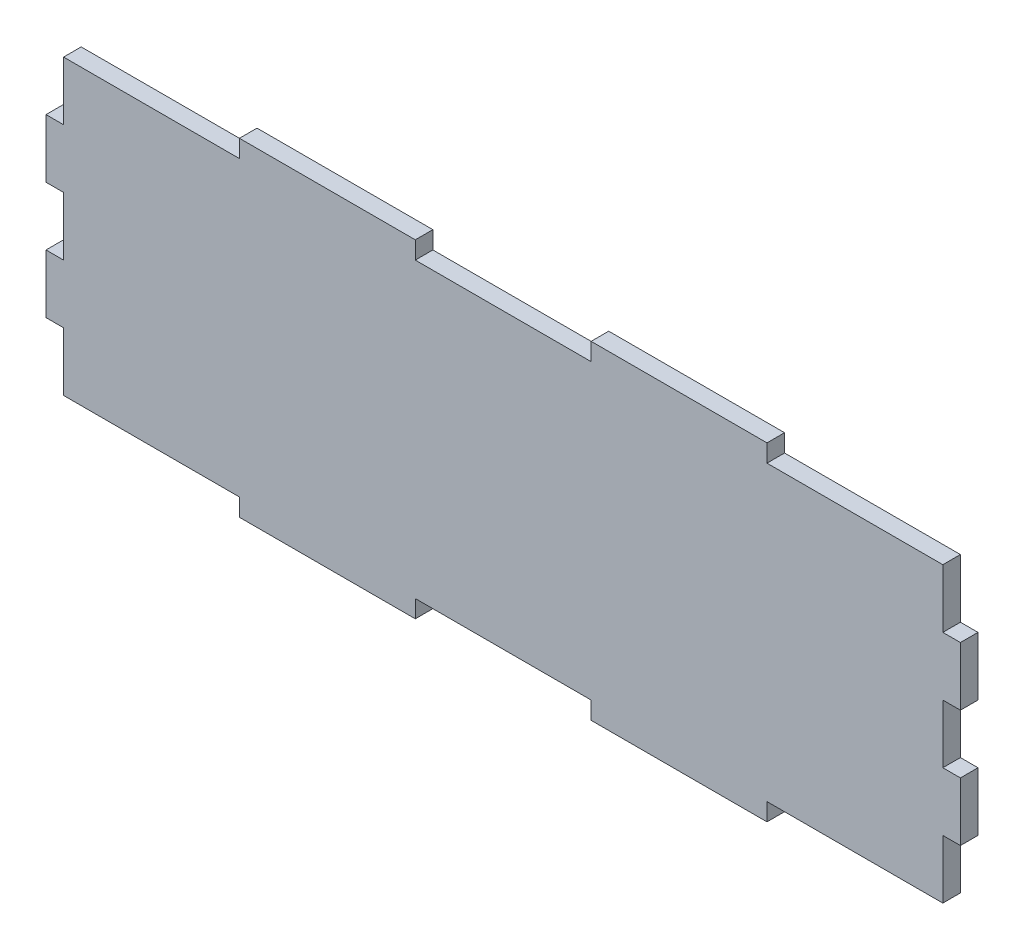
ISO-10303-21;
HEADER;
FILE_DESCRIPTION(('STEP AP214'),'2;1');
FILE_NAME('part.step','',(''),(''),'','','');
FILE_SCHEMA(('AUTOMOTIVE_DESIGN { 1 0 10303 214 1 1 1 1 }'));
ENDSEC;
DATA;
#1=APPLICATION_CONTEXT('core data for automotive mechanical design processes');
#2=APPLICATION_PROTOCOL_DEFINITION('international standard','automotive_design',2000,#1);
#3=PRODUCT_CONTEXT('',#1,'mechanical');
#4=PRODUCT('Part','Part','',(#3));
#5=PRODUCT_RELATED_PRODUCT_CATEGORY('part','',(#4));
#6=PRODUCT_DEFINITION_FORMATION('','',#4);
#7=PRODUCT_DEFINITION_CONTEXT('part definition',#1,'design');
#8=PRODUCT_DEFINITION('design','',#6,#7);
#9=PRODUCT_DEFINITION_SHAPE('','',#8);
#10=(LENGTH_UNIT() NAMED_UNIT(*) SI_UNIT(.MILLI.,.METRE.));
#11=(NAMED_UNIT(*) PLANE_ANGLE_UNIT() SI_UNIT($,.RADIAN.));
#12=(NAMED_UNIT(*) SI_UNIT($,.STERADIAN.) SOLID_ANGLE_UNIT());
#13=UNCERTAINTY_MEASURE_WITH_UNIT(LENGTH_MEASURE(1.E-05),#10,'distance_accuracy_value','');
#14=(GEOMETRIC_REPRESENTATION_CONTEXT(3) GLOBAL_UNCERTAINTY_ASSIGNED_CONTEXT((#13)) GLOBAL_UNIT_ASSIGNED_CONTEXT((#10,
#11,#12)) REPRESENTATION_CONTEXT('',''));
#15=CARTESIAN_POINT('',(0.,0.,0.));
#16=DIRECTION('',(0.,0.,1.));
#17=DIRECTION('',(1.,0.,0.));
#18=AXIS2_PLACEMENT_3D('',#15,#16,#17);
#19=CARTESIAN_POINT('',(0.,-23.,3.));
#20=DIRECTION('',(-1.,0.,0.));
#21=DIRECTION('',(0.,-1.,0.));
#22=AXIS2_PLACEMENT_3D('',#19,#20,#21);
#23=PLANE('',#22);
#24=DIRECTION('',(0.,1.,0.));
#25=VECTOR('',#24,1.);
#26=CARTESIAN_POINT('',(0.,-23.,0.));
#27=LINE('',#26,#25);
#28=CARTESIAN_POINT('',(0.,-23.,0.));
#29=VERTEX_POINT('',#28);
#30=CARTESIAN_POINT('',(0.,-20.,0.));
#31=VERTEX_POINT('',#30);
#32=EDGE_CURVE('E302',#29,#31,#27,.T.);
#33=ORIENTED_EDGE('',*,*,#32,.T.);
#34=DIRECTION('',(0.,0.,-1.));
#35=VECTOR('',#34,1.);
#36=CARTESIAN_POINT('',(0.,-20.,3.));
#37=LINE('',#36,#35);
#38=CARTESIAN_POINT('',(0.,-20.,3.));
#39=VERTEX_POINT('',#38);
#40=EDGE_CURVE('E11',#39,#31,#37,.T.);
#41=ORIENTED_EDGE('',*,*,#40,.F.);
#42=DIRECTION('',(0.,1.,0.));
#43=VECTOR('',#42,1.);
#44=CARTESIAN_POINT('',(0.,-23.,3.));
#45=LINE('',#44,#43);
#46=CARTESIAN_POINT('',(0.,-23.,3.));
#47=VERTEX_POINT('',#46);
#48=EDGE_CURVE('E372',#47,#39,#45,.T.);
#49=ORIENTED_EDGE('',*,*,#48,.F.);
#50=DIRECTION('',(0.,0.,-1.));
#51=VECTOR('',#50,1.);
#52=CARTESIAN_POINT('',(0.,-23.,3.));
#53=LINE('',#52,#51);
#54=EDGE_CURVE('E298',#47,#29,#53,.T.);
#55=ORIENTED_EDGE('',*,*,#54,.T.);
#56=EDGE_LOOP('',(#33,#41,#49,#55));
#57=FACE_BOUND('',#56,.T.);
#58=ADVANCED_FACE('F38',(#57),#23,.F.);
#59=CARTESIAN_POINT('',(0.,-20.,3.));
#60=DIRECTION('',(0.,1.,0.));
#61=DIRECTION('',(0.,0.,1.));
#62=AXIS2_PLACEMENT_3D('',#59,#60,#61);
#63=PLANE('',#62);
#64=DIRECTION('',(1.,0.,0.));
#65=VECTOR('',#64,1.);
#66=CARTESIAN_POINT('',(0.,-20.,0.));
#67=LINE('',#66,#65);
#68=CARTESIAN_POINT('',(30.,-20.,0.));
#69=VERTEX_POINT('',#68);
#70=EDGE_CURVE('E305',#31,#69,#67,.T.);
#71=ORIENTED_EDGE('',*,*,#70,.T.);
#72=DIRECTION('',(0.,0.,-1.));
#73=VECTOR('',#72,1.);
#74=CARTESIAN_POINT('',(30.,-20.,3.));
#75=LINE('',#74,#73);
#76=CARTESIAN_POINT('',(30.,-20.,3.));
#77=VERTEX_POINT('',#76);
#78=EDGE_CURVE('E46',#77,#69,#75,.T.);
#79=ORIENTED_EDGE('',*,*,#78,.F.);
#80=DIRECTION('',(1.,0.,0.));
#81=VECTOR('',#80,1.);
#82=CARTESIAN_POINT('',(0.,-20.,3.));
#83=LINE('',#82,#81);
#84=EDGE_CURVE('E181',#39,#77,#83,.T.);
#85=ORIENTED_EDGE('',*,*,#84,.F.);
#86=ORIENTED_EDGE('',*,*,#40,.T.);
#87=EDGE_LOOP('',(#71,#79,#85,#86));
#88=FACE_BOUND('',#87,.T.);
#89=ADVANCED_FACE('F570',(#88),#63,.F.);
#90=CARTESIAN_POINT('',(30.,-20.,3.));
#91=DIRECTION('',(-1.,0.,0.));
#92=DIRECTION('',(0.,0.,1.));
#93=AXIS2_PLACEMENT_3D('',#90,#91,#92);
#94=PLANE('',#93);
#95=DIRECTION('',(0.,1.,0.));
#96=VECTOR('',#95,1.);
#97=CARTESIAN_POINT('',(30.,-20.,0.));
#98=LINE('',#97,#96);
#99=CARTESIAN_POINT('',(30.,-10.,0.));
#100=VERTEX_POINT('',#99);
#101=EDGE_CURVE('E307',#69,#100,#98,.T.);
#102=ORIENTED_EDGE('',*,*,#101,.T.);
#103=DIRECTION('',(0.,0.,-1.));
#104=VECTOR('',#103,1.);
#105=CARTESIAN_POINT('',(30.,-10.,3.));
#106=LINE('',#105,#104);
#107=CARTESIAN_POINT('',(30.,-10.,3.));
#108=VERTEX_POINT('',#107);
#109=EDGE_CURVE('E463',#108,#100,#106,.T.);
#110=ORIENTED_EDGE('',*,*,#109,.F.);
#111=DIRECTION('',(0.,1.,0.));
#112=VECTOR('',#111,1.);
#113=CARTESIAN_POINT('',(30.,-20.,3.));
#114=LINE('',#113,#112);
#115=EDGE_CURVE('E471',#77,#108,#114,.T.);
#116=ORIENTED_EDGE('',*,*,#115,.F.);
#117=ORIENTED_EDGE('',*,*,#78,.T.);
#118=EDGE_LOOP('',(#102,#110,#116,#117));
#119=FACE_BOUND('',#118,.T.);
#120=ADVANCED_FACE('F469',(#119),#94,.F.);
#121=CARTESIAN_POINT('',(30.,-10.,3.));
#122=DIRECTION('',(0.,1.,0.));
#123=DIRECTION('',(-1.,0.,0.));
#124=AXIS2_PLACEMENT_3D('',#121,#122,#123);
#125=PLANE('',#124);
#126=DIRECTION('',(1.,0.,0.));
#127=VECTOR('',#126,1.);
#128=CARTESIAN_POINT('',(30.,-10.,0.));
#129=LINE('',#128,#127);
#130=CARTESIAN_POINT('',(33.,-10.,0.));
#131=VERTEX_POINT('',#130);
#132=EDGE_CURVE('E309',#100,#131,#129,.T.);
#133=ORIENTED_EDGE('',*,*,#132,.T.);
#134=DIRECTION('',(0.,0.,-1.));
#135=VECTOR('',#134,1.);
#136=CARTESIAN_POINT('',(33.,-10.,3.));
#137=LINE('',#136,#135);
#138=CARTESIAN_POINT('',(33.,-10.,3.));
#139=VERTEX_POINT('',#138);
#140=EDGE_CURVE('E460',#139,#131,#137,.T.);
#141=ORIENTED_EDGE('',*,*,#140,.F.);
#142=DIRECTION('',(1.,0.,0.));
#143=VECTOR('',#142,1.);
#144=CARTESIAN_POINT('',(30.,-10.,3.));
#145=LINE('',#144,#143);
#146=EDGE_CURVE('E489',#108,#139,#145,.T.);
#147=ORIENTED_EDGE('',*,*,#146,.F.);
#148=ORIENTED_EDGE('',*,*,#109,.T.);
#149=EDGE_LOOP('',(#133,#141,#147,#148));
#150=FACE_BOUND('',#149,.T.);
#151=ADVANCED_FACE('F480',(#150),#125,.F.);
#152=CARTESIAN_POINT('',(33.,-10.,3.));
#153=DIRECTION('',(-1.,0.,0.));
#154=DIRECTION('',(0.,0.,1.));
#155=AXIS2_PLACEMENT_3D('',#152,#153,#154);
#156=PLANE('',#155);
#157=DIRECTION('',(0.,1.,0.));
#158=VECTOR('',#157,1.);
#159=CARTESIAN_POINT('',(33.,-10.,0.));
#160=LINE('',#159,#158);
#161=CARTESIAN_POINT('',(33.,0.,0.));
#162=VERTEX_POINT('',#161);
#163=EDGE_CURVE('E311',#131,#162,#160,.T.);
#164=ORIENTED_EDGE('',*,*,#163,.T.);
#165=DIRECTION('',(0.,0.,-1.));
#166=VECTOR('',#165,1.);
#167=CARTESIAN_POINT('',(33.,0.,3.));
#168=LINE('',#167,#166);
#169=CARTESIAN_POINT('',(33.,0.,3.));
#170=VERTEX_POINT('',#169);
#171=EDGE_CURVE('E457',#170,#162,#168,.T.);
#172=ORIENTED_EDGE('',*,*,#171,.F.);
#173=DIRECTION('',(0.,1.,0.));
#174=VECTOR('',#173,1.);
#175=CARTESIAN_POINT('',(33.,-10.,3.));
#176=LINE('',#175,#174);
#177=EDGE_CURVE('E486',#139,#170,#176,.T.);
#178=ORIENTED_EDGE('',*,*,#177,.F.);
#179=ORIENTED_EDGE('',*,*,#140,.T.);
#180=EDGE_LOOP('',(#164,#172,#178,#179));
#181=FACE_BOUND('',#180,.T.);
#182=ADVANCED_FACE('F484',(#181),#156,.F.);
#183=CARTESIAN_POINT('',(33.,0.,3.));
#184=DIRECTION('',(0.,-1.,0.));
#185=DIRECTION('',(1.,0.,0.));
#186=AXIS2_PLACEMENT_3D('',#183,#184,#185);
#187=PLANE('',#186);
#188=DIRECTION('',(-1.,0.,0.));
#189=VECTOR('',#188,1.);
#190=CARTESIAN_POINT('',(33.,0.,0.));
#191=LINE('',#190,#189);
#192=CARTESIAN_POINT('',(30.,0.,0.));
#193=VERTEX_POINT('',#192);
#194=EDGE_CURVE('E313',#162,#193,#191,.T.);
#195=ORIENTED_EDGE('',*,*,#194,.T.);
#196=DIRECTION('',(0.,0.,-1.));
#197=VECTOR('',#196,1.);
#198=CARTESIAN_POINT('',(30.,0.,3.));
#199=LINE('',#198,#197);
#200=CARTESIAN_POINT('',(30.,0.,3.));
#201=VERTEX_POINT('',#200);
#202=EDGE_CURVE('E454',#201,#193,#199,.T.);
#203=ORIENTED_EDGE('',*,*,#202,.F.);
#204=DIRECTION('',(-1.,0.,0.));
#205=VECTOR('',#204,1.);
#206=CARTESIAN_POINT('',(33.,0.,3.));
#207=LINE('',#206,#205);
#208=EDGE_CURVE('E488',#170,#201,#207,.T.);
#209=ORIENTED_EDGE('',*,*,#208,.F.);
#210=ORIENTED_EDGE('',*,*,#171,.T.);
#211=EDGE_LOOP('',(#195,#203,#209,#210));
#212=FACE_BOUND('',#211,.T.);
#213=ADVANCED_FACE('F583',(#212),#187,.F.);
#214=CARTESIAN_POINT('',(30.,0.,3.));
#215=DIRECTION('',(-1.,0.,0.));
#216=DIRECTION('',(0.,-1.,0.));
#217=AXIS2_PLACEMENT_3D('',#214,#215,#216);
#218=PLANE('',#217);
#219=DIRECTION('',(0.,1.,0.));
#220=VECTOR('',#219,1.);
#221=CARTESIAN_POINT('',(30.,0.,0.));
#222=LINE('',#221,#220);
#223=CARTESIAN_POINT('',(30.,10.,0.));
#224=VERTEX_POINT('',#223);
#225=EDGE_CURVE('E315',#193,#224,#222,.T.);
#226=ORIENTED_EDGE('',*,*,#225,.T.);
#227=DIRECTION('',(0.,0.,-1.));
#228=VECTOR('',#227,1.);
#229=CARTESIAN_POINT('',(30.,10.,3.));
#230=LINE('',#229,#228);
#231=CARTESIAN_POINT('',(30.,10.,3.));
#232=VERTEX_POINT('',#231);
#233=EDGE_CURVE('E451',#232,#224,#230,.T.);
#234=ORIENTED_EDGE('',*,*,#233,.F.);
#235=DIRECTION('',(0.,1.,0.));
#236=VECTOR('',#235,1.);
#237=CARTESIAN_POINT('',(30.,0.,3.));
#238=LINE('',#237,#236);
#239=EDGE_CURVE('E491',#201,#232,#238,.T.);
#240=ORIENTED_EDGE('',*,*,#239,.F.);
#241=ORIENTED_EDGE('',*,*,#202,.T.);
#242=EDGE_LOOP('',(#226,#234,#240,#241));
#243=FACE_BOUND('',#242,.T.);
#244=ADVANCED_FACE('F586',(#243),#218,.F.);
#245=CARTESIAN_POINT('',(30.,10.,3.));
#246=DIRECTION('',(0.,1.,0.));
#247=DIRECTION('',(0.,0.,1.));
#248=AXIS2_PLACEMENT_3D('',#245,#246,#247);
#249=PLANE('',#248);
#250=DIRECTION('',(1.,0.,0.));
#251=VECTOR('',#250,1.);
#252=CARTESIAN_POINT('',(30.,10.,0.));
#253=LINE('',#252,#251);
#254=CARTESIAN_POINT('',(33.,10.,0.));
#255=VERTEX_POINT('',#254);
#256=EDGE_CURVE('E317',#224,#255,#253,.T.);
#257=ORIENTED_EDGE('',*,*,#256,.T.);
#258=DIRECTION('',(0.,0.,-1.));
#259=VECTOR('',#258,1.);
#260=CARTESIAN_POINT('',(33.,10.,3.));
#261=LINE('',#260,#259);
#262=CARTESIAN_POINT('',(33.,10.,3.));
#263=VERTEX_POINT('',#262);
#264=EDGE_CURVE('E448',#263,#255,#261,.T.);
#265=ORIENTED_EDGE('',*,*,#264,.F.);
#266=DIRECTION('',(1.,0.,0.));
#267=VECTOR('',#266,1.);
#268=CARTESIAN_POINT('',(30.,10.,3.));
#269=LINE('',#268,#267);
#270=EDGE_CURVE('E497',#232,#263,#269,.T.);
#271=ORIENTED_EDGE('',*,*,#270,.F.);
#272=ORIENTED_EDGE('',*,*,#233,.T.);
#273=EDGE_LOOP('',(#257,#265,#271,#272));
#274=FACE_BOUND('',#273,.T.);
#275=ADVANCED_FACE('F590',(#274),#249,.F.);
#276=CARTESIAN_POINT('',(33.,10.,3.));
#277=DIRECTION('',(-1.,0.,0.));
#278=DIRECTION('',(0.,-1.,0.));
#279=AXIS2_PLACEMENT_3D('',#276,#277,#278);
#280=PLANE('',#279);
#281=DIRECTION('',(0.,1.,0.));
#282=VECTOR('',#281,1.);
#283=CARTESIAN_POINT('',(33.,10.,0.));
#284=LINE('',#283,#282);
#285=CARTESIAN_POINT('',(33.,20.,0.));
#286=VERTEX_POINT('',#285);
#287=EDGE_CURVE('E319',#255,#286,#284,.T.);
#288=ORIENTED_EDGE('',*,*,#287,.T.);
#289=DIRECTION('',(0.,0.,-1.));
#290=VECTOR('',#289,1.);
#291=CARTESIAN_POINT('',(33.,20.,3.));
#292=LINE('',#291,#290);
#293=CARTESIAN_POINT('',(33.,20.,3.));
#294=VERTEX_POINT('',#293);
#295=EDGE_CURVE('E445',#294,#286,#292,.T.);
#296=ORIENTED_EDGE('',*,*,#295,.F.);
#297=DIRECTION('',(0.,1.,0.));
#298=VECTOR('',#297,1.);
#299=CARTESIAN_POINT('',(33.,10.,3.));
#300=LINE('',#299,#298);
#301=EDGE_CURVE('E499',#263,#294,#300,.T.);
#302=ORIENTED_EDGE('',*,*,#301,.F.);
#303=ORIENTED_EDGE('',*,*,#264,.T.);
#304=EDGE_LOOP('',(#288,#296,#302,#303));
#305=FACE_BOUND('',#304,.T.);
#306=ADVANCED_FACE('F594',(#305),#280,.F.);
#307=CARTESIAN_POINT('',(33.,20.,3.));
#308=DIRECTION('',(0.,-1.,0.));
#309=DIRECTION('',(1.,0.,0.));
#310=AXIS2_PLACEMENT_3D('',#307,#308,#309);
#311=PLANE('',#310);
#312=DIRECTION('',(-1.,0.,0.));
#313=VECTOR('',#312,1.);
#314=CARTESIAN_POINT('',(33.,20.,0.));
#315=LINE('',#314,#313);
#316=CARTESIAN_POINT('',(30.,20.,0.));
#317=VERTEX_POINT('',#316);
#318=EDGE_CURVE('E321',#286,#317,#315,.T.);
#319=ORIENTED_EDGE('',*,*,#318,.T.);
#320=DIRECTION('',(0.,0.,-1.));
#321=VECTOR('',#320,1.);
#322=CARTESIAN_POINT('',(30.,20.,3.));
#323=LINE('',#322,#321);
#324=CARTESIAN_POINT('',(30.,20.,3.));
#325=VERTEX_POINT('',#324);
#326=EDGE_CURVE('E442',#325,#317,#323,.T.);
#327=ORIENTED_EDGE('',*,*,#326,.F.);
#328=DIRECTION('',(-1.,0.,0.));
#329=VECTOR('',#328,1.);
#330=CARTESIAN_POINT('',(33.,20.,3.));
#331=LINE('',#330,#329);
#332=EDGE_CURVE('E501',#294,#325,#331,.T.);
#333=ORIENTED_EDGE('',*,*,#332,.F.);
#334=ORIENTED_EDGE('',*,*,#295,.T.);
#335=EDGE_LOOP('',(#319,#327,#333,#334));
#336=FACE_BOUND('',#335,.T.);
#337=ADVANCED_FACE('F598',(#336),#311,.F.);
#338=CARTESIAN_POINT('',(30.,20.,3.));
#339=DIRECTION('',(-1.,0.,0.));
#340=DIRECTION('',(0.,0.,1.));
#341=AXIS2_PLACEMENT_3D('',#338,#339,#340);
#342=PLANE('',#341);
#343=DIRECTION('',(0.,1.,0.));
#344=VECTOR('',#343,1.);
#345=CARTESIAN_POINT('',(30.,20.,0.));
#346=LINE('',#345,#344);
#347=CARTESIAN_POINT('',(30.,30.,0.));
#348=VERTEX_POINT('',#347);
#349=EDGE_CURVE('E323',#317,#348,#346,.T.);
#350=ORIENTED_EDGE('',*,*,#349,.T.);
#351=DIRECTION('',(0.,0.,-1.));
#352=VECTOR('',#351,1.);
#353=CARTESIAN_POINT('',(30.,30.,3.));
#354=LINE('',#353,#352);
#355=CARTESIAN_POINT('',(30.,30.,3.));
#356=VERTEX_POINT('',#355);
#357=EDGE_CURVE('E439',#356,#348,#354,.T.);
#358=ORIENTED_EDGE('',*,*,#357,.F.);
#359=DIRECTION('',(0.,1.,0.));
#360=VECTOR('',#359,1.);
#361=CARTESIAN_POINT('',(30.,20.,3.));
#362=LINE('',#361,#360);
#363=EDGE_CURVE('E503',#325,#356,#362,.T.);
#364=ORIENTED_EDGE('',*,*,#363,.F.);
#365=ORIENTED_EDGE('',*,*,#326,.T.);
#366=EDGE_LOOP('',(#350,#358,#364,#365));
#367=FACE_BOUND('',#366,.T.);
#368=ADVANCED_FACE('F602',(#367),#342,.F.);
#369=CARTESIAN_POINT('',(30.,30.,3.));
#370=DIRECTION('',(0.,-1.,0.));
#371=DIRECTION('',(1.,0.,0.));
#372=AXIS2_PLACEMENT_3D('',#369,#370,#371);
#373=PLANE('',#372);
#374=DIRECTION('',(-1.,0.,0.));
#375=VECTOR('',#374,1.);
#376=CARTESIAN_POINT('',(30.,30.,0.));
#377=LINE('',#376,#375);
#378=CARTESIAN_POINT('',(0.,30.,0.));
#379=VERTEX_POINT('',#378);
#380=EDGE_CURVE('E325',#348,#379,#377,.T.);
#381=ORIENTED_EDGE('',*,*,#380,.T.);
#382=DIRECTION('',(0.,0.,-1.));
#383=VECTOR('',#382,1.);
#384=CARTESIAN_POINT('',(0.,30.,3.));
#385=LINE('',#384,#383);
#386=CARTESIAN_POINT('',(0.,30.,3.));
#387=VERTEX_POINT('',#386);
#388=EDGE_CURVE('E436',#387,#379,#385,.T.);
#389=ORIENTED_EDGE('',*,*,#388,.F.);
#390=DIRECTION('',(-1.,0.,0.));
#391=VECTOR('',#390,1.);
#392=CARTESIAN_POINT('',(30.,30.,3.));
#393=LINE('',#392,#391);
#394=EDGE_CURVE('E505',#356,#387,#393,.T.);
#395=ORIENTED_EDGE('',*,*,#394,.F.);
#396=ORIENTED_EDGE('',*,*,#357,.T.);
#397=EDGE_LOOP('',(#381,#389,#395,#396));
#398=FACE_BOUND('',#397,.T.);
#399=ADVANCED_FACE('F606',(#398),#373,.F.);
#400=CARTESIAN_POINT('',(0.,30.,3.));
#401=DIRECTION('',(-1.,0.,0.));
#402=DIRECTION('',(0.,0.,1.));
#403=AXIS2_PLACEMENT_3D('',#400,#401,#402);
#404=PLANE('',#403);
#405=DIRECTION('',(0.,1.,0.));
#406=VECTOR('',#405,1.);
#407=CARTESIAN_POINT('',(0.,30.,0.));
#408=LINE('',#407,#406);
#409=CARTESIAN_POINT('',(0.,33.,0.));
#410=VERTEX_POINT('',#409);
#411=EDGE_CURVE('E327',#379,#410,#408,.T.);
#412=ORIENTED_EDGE('',*,*,#411,.T.);
#413=DIRECTION('',(0.,0.,-1.));
#414=VECTOR('',#413,1.);
#415=CARTESIAN_POINT('',(0.,33.,3.));
#416=LINE('',#415,#414);
#417=CARTESIAN_POINT('',(0.,33.,3.));
#418=VERTEX_POINT('',#417);
#419=EDGE_CURVE('E433',#418,#410,#416,.T.);
#420=ORIENTED_EDGE('',*,*,#419,.F.);
#421=DIRECTION('',(0.,1.,0.));
#422=VECTOR('',#421,1.);
#423=CARTESIAN_POINT('',(0.,30.,3.));
#424=LINE('',#423,#422);
#425=EDGE_CURVE('E507',#387,#418,#424,.T.);
#426=ORIENTED_EDGE('',*,*,#425,.F.);
#427=ORIENTED_EDGE('',*,*,#388,.T.);
#428=EDGE_LOOP('',(#412,#420,#426,#427));
#429=FACE_BOUND('',#428,.T.);
#430=ADVANCED_FACE('F610',(#429),#404,.F.);
#431=CARTESIAN_POINT('',(-30.,33.,3.));
#432=DIRECTION('',(0.,-1.,0.));
#433=DIRECTION('',(0.,0.,-1.));
#434=AXIS2_PLACEMENT_3D('',#431,#432,#433);
#435=PLANE('',#434);
#436=DIRECTION('',(-1.,0.,0.));
#437=VECTOR('',#436,1.);
#438=CARTESIAN_POINT('',(-30.,33.,0.));
#439=LINE('',#438,#437);
#440=CARTESIAN_POINT('',(-30.,33.,0.));
#441=VERTEX_POINT('',#440);
#442=EDGE_CURVE('E329',#410,#441,#439,.T.);
#443=ORIENTED_EDGE('',*,*,#442,.T.);
#444=DIRECTION('',(0.,0.,-1.));
#445=VECTOR('',#444,1.);
#446=CARTESIAN_POINT('',(-30.,33.,3.));
#447=LINE('',#446,#445);
#448=CARTESIAN_POINT('',(-30.,33.,3.));
#449=VERTEX_POINT('',#448);
#450=EDGE_CURVE('E430',#449,#441,#447,.T.);
#451=ORIENTED_EDGE('',*,*,#450,.F.);
#452=DIRECTION('',(-1.,0.,0.));
#453=VECTOR('',#452,1.);
#454=CARTESIAN_POINT('',(-30.,33.,3.));
#455=LINE('',#454,#453);
#456=EDGE_CURVE('E509',#418,#449,#455,.T.);
#457=ORIENTED_EDGE('',*,*,#456,.F.);
#458=ORIENTED_EDGE('',*,*,#419,.T.);
#459=EDGE_LOOP('',(#443,#451,#457,#458));
#460=FACE_BOUND('',#459,.T.);
#461=ADVANCED_FACE('F614',(#460),#435,.F.);
#462=CARTESIAN_POINT('',(-30.,33.,3.));
#463=DIRECTION('',(1.,0.,0.));
#464=DIRECTION('',(0.,1.,0.));
#465=AXIS2_PLACEMENT_3D('',#462,#463,#464);
#466=PLANE('',#465);
#467=DIRECTION('',(0.,-1.,0.));
#468=VECTOR('',#467,1.);
#469=CARTESIAN_POINT('',(-30.,33.,0.));
#470=LINE('',#469,#468);
#471=CARTESIAN_POINT('',(-30.,30.,0.));
#472=VERTEX_POINT('',#471);
#473=EDGE_CURVE('E331',#441,#472,#470,.T.);
#474=ORIENTED_EDGE('',*,*,#473,.T.);
#475=DIRECTION('',(0.,0.,-1.));
#476=VECTOR('',#475,1.);
#477=CARTESIAN_POINT('',(-30.,30.,3.));
#478=LINE('',#477,#476);
#479=CARTESIAN_POINT('',(-30.,30.,3.));
#480=VERTEX_POINT('',#479);
#481=EDGE_CURVE('E427',#480,#472,#478,.T.);
#482=ORIENTED_EDGE('',*,*,#481,.F.);
#483=DIRECTION('',(0.,-1.,0.));
#484=VECTOR('',#483,1.);
#485=CARTESIAN_POINT('',(-30.,33.,3.));
#486=LINE('',#485,#484);
#487=EDGE_CURVE('E511',#449,#480,#486,.T.);
#488=ORIENTED_EDGE('',*,*,#487,.F.);
#489=ORIENTED_EDGE('',*,*,#450,.T.);
#490=EDGE_LOOP('',(#474,#482,#488,#489));
#491=FACE_BOUND('',#490,.T.);
#492=ADVANCED_FACE('F618',(#491),#466,.F.);
#493=CARTESIAN_POINT('',(-59.9999999999999,30.,3.));
#494=DIRECTION('',(0.,-1.,0.));
#495=DIRECTION('',(0.,0.,-1.));
#496=AXIS2_PLACEMENT_3D('',#493,#494,#495);
#497=PLANE('',#496);
#498=DIRECTION('',(-1.,0.,0.));
#499=VECTOR('',#498,1.);
#500=CARTESIAN_POINT('',(-59.9999999999999,30.,0.));
#501=LINE('',#500,#499);
#502=CARTESIAN_POINT('',(-59.9999999999999,30.,0.));
#503=VERTEX_POINT('',#502);
#504=EDGE_CURVE('E333',#472,#503,#501,.T.);
#505=ORIENTED_EDGE('',*,*,#504,.T.);
#506=DIRECTION('',(0.,0.,-1.));
#507=VECTOR('',#506,1.);
#508=CARTESIAN_POINT('',(-59.9999999999999,30.,3.));
#509=LINE('',#508,#507);
#510=CARTESIAN_POINT('',(-59.9999999999999,30.,3.));
#511=VERTEX_POINT('',#510);
#512=EDGE_CURVE('E424',#511,#503,#509,.T.);
#513=ORIENTED_EDGE('',*,*,#512,.F.);
#514=DIRECTION('',(-1.,0.,0.));
#515=VECTOR('',#514,1.);
#516=CARTESIAN_POINT('',(-59.9999999999999,30.,3.));
#517=LINE('',#516,#515);
#518=EDGE_CURVE('E513',#480,#511,#517,.T.);
#519=ORIENTED_EDGE('',*,*,#518,.F.);
#520=ORIENTED_EDGE('',*,*,#481,.T.);
#521=EDGE_LOOP('',(#505,#513,#519,#520));
#522=FACE_BOUND('',#521,.T.);
#523=ADVANCED_FACE('F622',(#522),#497,.F.);
#524=CARTESIAN_POINT('',(-59.9999999999999,30.,3.));
#525=DIRECTION('',(-1.,0.,0.));
#526=DIRECTION('',(0.,-1.,0.));
#527=AXIS2_PLACEMENT_3D('',#524,#525,#526);
#528=PLANE('',#527);
#529=DIRECTION('',(0.,1.,0.));
#530=VECTOR('',#529,1.);
#531=CARTESIAN_POINT('',(-59.9999999999999,30.,0.));
#532=LINE('',#531,#530);
#533=CARTESIAN_POINT('',(-60.,33.,0.));
#534=VERTEX_POINT('',#533);
#535=EDGE_CURVE('E335',#503,#534,#532,.T.);
#536=ORIENTED_EDGE('',*,*,#535,.T.);
#537=DIRECTION('',(0.,0.,-1.));
#538=VECTOR('',#537,1.);
#539=CARTESIAN_POINT('',(-60.,33.,3.));
#540=LINE('',#539,#538);
#541=CARTESIAN_POINT('',(-60.,33.,3.));
#542=VERTEX_POINT('',#541);
#543=EDGE_CURVE('E421',#542,#534,#540,.T.);
#544=ORIENTED_EDGE('',*,*,#543,.F.);
#545=DIRECTION('',(0.,1.,0.));
#546=VECTOR('',#545,1.);
#547=CARTESIAN_POINT('',(-59.9999999999999,30.,3.));
#548=LINE('',#547,#546);
#549=EDGE_CURVE('E515',#511,#542,#548,.T.);
#550=ORIENTED_EDGE('',*,*,#549,.F.);
#551=ORIENTED_EDGE('',*,*,#512,.T.);
#552=EDGE_LOOP('',(#536,#544,#550,#551));
#553=FACE_BOUND('',#552,.T.);
#554=ADVANCED_FACE('F626',(#553),#528,.F.);
#555=CARTESIAN_POINT('',(-90.,33.,3.));
#556=DIRECTION('',(0.,-1.,0.));
#557=DIRECTION('',(1.,0.,0.));
#558=AXIS2_PLACEMENT_3D('',#555,#556,#557);
#559=PLANE('',#558);
#560=DIRECTION('',(-1.,0.,0.));
#561=VECTOR('',#560,1.);
#562=CARTESIAN_POINT('',(-90.,33.,0.));
#563=LINE('',#562,#561);
#564=CARTESIAN_POINT('',(-90.,33.,0.));
#565=VERTEX_POINT('',#564);
#566=EDGE_CURVE('E337',#534,#565,#563,.T.);
#567=ORIENTED_EDGE('',*,*,#566,.T.);
#568=DIRECTION('',(0.,0.,-1.));
#569=VECTOR('',#568,1.);
#570=CARTESIAN_POINT('',(-90.,33.,3.));
#571=LINE('',#570,#569);
#572=CARTESIAN_POINT('',(-90.,33.,3.));
#573=VERTEX_POINT('',#572);
#574=EDGE_CURVE('E418',#573,#565,#571,.T.);
#575=ORIENTED_EDGE('',*,*,#574,.F.);
#576=DIRECTION('',(-1.,0.,0.));
#577=VECTOR('',#576,1.);
#578=CARTESIAN_POINT('',(-90.,33.,3.));
#579=LINE('',#578,#577);
#580=EDGE_CURVE('E517',#542,#573,#579,.T.);
#581=ORIENTED_EDGE('',*,*,#580,.F.);
#582=ORIENTED_EDGE('',*,*,#543,.T.);
#583=EDGE_LOOP('',(#567,#575,#581,#582));
#584=FACE_BOUND('',#583,.T.);
#585=ADVANCED_FACE('F630',(#584),#559,.F.);
#586=CARTESIAN_POINT('',(-90.,33.,3.));
#587=DIRECTION('',(1.,0.,0.));
#588=DIRECTION('',(0.,0.,-1.));
#589=AXIS2_PLACEMENT_3D('',#586,#587,#588);
#590=PLANE('',#589);
#591=DIRECTION('',(0.,-1.,0.));
#592=VECTOR('',#591,1.);
#593=CARTESIAN_POINT('',(-90.,33.,0.));
#594=LINE('',#593,#592);
#595=CARTESIAN_POINT('',(-90.,30.,0.));
#596=VERTEX_POINT('',#595);
#597=EDGE_CURVE('E339',#565,#596,#594,.T.);
#598=ORIENTED_EDGE('',*,*,#597,.T.);
#599=DIRECTION('',(0.,0.,-1.));
#600=VECTOR('',#599,1.);
#601=CARTESIAN_POINT('',(-90.,30.,3.));
#602=LINE('',#601,#600);
#603=CARTESIAN_POINT('',(-90.,30.,3.));
#604=VERTEX_POINT('',#603);
#605=EDGE_CURVE('E415',#604,#596,#602,.T.);
#606=ORIENTED_EDGE('',*,*,#605,.F.);
#607=DIRECTION('',(0.,-1.,0.));
#608=VECTOR('',#607,1.);
#609=CARTESIAN_POINT('',(-90.,33.,3.));
#610=LINE('',#609,#608);
#611=EDGE_CURVE('E519',#573,#604,#610,.T.);
#612=ORIENTED_EDGE('',*,*,#611,.F.);
#613=ORIENTED_EDGE('',*,*,#574,.T.);
#614=EDGE_LOOP('',(#598,#606,#612,#613));
#615=FACE_BOUND('',#614,.T.);
#616=ADVANCED_FACE('F634',(#615),#590,.F.);
#617=CARTESIAN_POINT('',(-120.,30.,3.));
#618=DIRECTION('',(0.,-1.,0.));
#619=DIRECTION('',(0.,0.,-1.));
#620=AXIS2_PLACEMENT_3D('',#617,#618,#619);
#621=PLANE('',#620);
#622=DIRECTION('',(-1.,0.,0.));
#623=VECTOR('',#622,1.);
#624=CARTESIAN_POINT('',(-120.,30.,0.));
#625=LINE('',#624,#623);
#626=CARTESIAN_POINT('',(-120.,30.,0.));
#627=VERTEX_POINT('',#626);
#628=EDGE_CURVE('E341',#596,#627,#625,.T.);
#629=ORIENTED_EDGE('',*,*,#628,.T.);
#630=DIRECTION('',(0.,0.,-1.));
#631=VECTOR('',#630,1.);
#632=CARTESIAN_POINT('',(-120.,30.,3.));
#633=LINE('',#632,#631);
#634=CARTESIAN_POINT('',(-120.,30.,3.));
#635=VERTEX_POINT('',#634);
#636=EDGE_CURVE('E412',#635,#627,#633,.T.);
#637=ORIENTED_EDGE('',*,*,#636,.F.);
#638=DIRECTION('',(-1.,0.,0.));
#639=VECTOR('',#638,1.);
#640=CARTESIAN_POINT('',(-120.,30.,3.));
#641=LINE('',#640,#639);
#642=EDGE_CURVE('E521',#604,#635,#641,.T.);
#643=ORIENTED_EDGE('',*,*,#642,.F.);
#644=ORIENTED_EDGE('',*,*,#605,.T.);
#645=EDGE_LOOP('',(#629,#637,#643,#644));
#646=FACE_BOUND('',#645,.T.);
#647=ADVANCED_FACE('F638',(#646),#621,.F.);
#648=CARTESIAN_POINT('',(-120.,20.,3.));
#649=DIRECTION('',(1.,0.,0.));
#650=DIRECTION('',(0.,0.,-1.));
#651=AXIS2_PLACEMENT_3D('',#648,#649,#650);
#652=PLANE('',#651);
#653=DIRECTION('',(0.,-1.,0.));
#654=VECTOR('',#653,1.);
#655=CARTESIAN_POINT('',(-120.,20.,0.));
#656=LINE('',#655,#654);
#657=CARTESIAN_POINT('',(-120.,20.,0.));
#658=VERTEX_POINT('',#657);
#659=EDGE_CURVE('E343',#627,#658,#656,.T.);
#660=ORIENTED_EDGE('',*,*,#659,.T.);
#661=DIRECTION('',(0.,0.,-1.));
#662=VECTOR('',#661,1.);
#663=CARTESIAN_POINT('',(-120.,20.,3.));
#664=LINE('',#663,#662);
#665=CARTESIAN_POINT('',(-120.,20.,3.));
#666=VERTEX_POINT('',#665);
#667=EDGE_CURVE('E409',#666,#658,#664,.T.);
#668=ORIENTED_EDGE('',*,*,#667,.F.);
#669=DIRECTION('',(0.,-1.,0.));
#670=VECTOR('',#669,1.);
#671=CARTESIAN_POINT('',(-120.,20.,3.));
#672=LINE('',#671,#670);
#673=EDGE_CURVE('E523',#635,#666,#672,.T.);
#674=ORIENTED_EDGE('',*,*,#673,.F.);
#675=ORIENTED_EDGE('',*,*,#636,.T.);
#676=EDGE_LOOP('',(#660,#668,#674,#675));
#677=FACE_BOUND('',#676,.T.);
#678=ADVANCED_FACE('F642',(#677),#652,.F.);
#679=CARTESIAN_POINT('',(-123.,20.,3.));
#680=DIRECTION('',(0.,-1.,0.));
#681=DIRECTION('',(0.,0.,-1.));
#682=AXIS2_PLACEMENT_3D('',#679,#680,#681);
#683=PLANE('',#682);
#684=DIRECTION('',(-1.,0.,0.));
#685=VECTOR('',#684,1.);
#686=CARTESIAN_POINT('',(-123.,20.,0.));
#687=LINE('',#686,#685);
#688=CARTESIAN_POINT('',(-123.,20.,0.));
#689=VERTEX_POINT('',#688);
#690=EDGE_CURVE('E345',#658,#689,#687,.T.);
#691=ORIENTED_EDGE('',*,*,#690,.T.);
#692=DIRECTION('',(0.,0.,-1.));
#693=VECTOR('',#692,1.);
#694=CARTESIAN_POINT('',(-123.,20.,3.));
#695=LINE('',#694,#693);
#696=CARTESIAN_POINT('',(-123.,20.,3.));
#697=VERTEX_POINT('',#696);
#698=EDGE_CURVE('E406',#697,#689,#695,.T.);
#699=ORIENTED_EDGE('',*,*,#698,.F.);
#700=DIRECTION('',(-1.,0.,0.));
#701=VECTOR('',#700,1.);
#702=CARTESIAN_POINT('',(-123.,20.,3.));
#703=LINE('',#702,#701);
#704=EDGE_CURVE('E525',#666,#697,#703,.T.);
#705=ORIENTED_EDGE('',*,*,#704,.F.);
#706=ORIENTED_EDGE('',*,*,#667,.T.);
#707=EDGE_LOOP('',(#691,#699,#705,#706));
#708=FACE_BOUND('',#707,.T.);
#709=ADVANCED_FACE('F646',(#708),#683,.F.);
#710=CARTESIAN_POINT('',(-123.,10.,3.));
#711=DIRECTION('',(1.,0.,0.));
#712=DIRECTION('',(0.,0.,-1.));
#713=AXIS2_PLACEMENT_3D('',#710,#711,#712);
#714=PLANE('',#713);
#715=DIRECTION('',(0.,-1.,0.));
#716=VECTOR('',#715,1.);
#717=CARTESIAN_POINT('',(-123.,10.,0.));
#718=LINE('',#717,#716);
#719=CARTESIAN_POINT('',(-123.,10.,0.));
#720=VERTEX_POINT('',#719);
#721=EDGE_CURVE('E347',#689,#720,#718,.T.);
#722=ORIENTED_EDGE('',*,*,#721,.T.);
#723=DIRECTION('',(0.,0.,-1.));
#724=VECTOR('',#723,1.);
#725=CARTESIAN_POINT('',(-123.,10.,3.));
#726=LINE('',#725,#724);
#727=CARTESIAN_POINT('',(-123.,10.,3.));
#728=VERTEX_POINT('',#727);
#729=EDGE_CURVE('E403',#728,#720,#726,.T.);
#730=ORIENTED_EDGE('',*,*,#729,.F.);
#731=DIRECTION('',(0.,-1.,0.));
#732=VECTOR('',#731,1.);
#733=CARTESIAN_POINT('',(-123.,10.,3.));
#734=LINE('',#733,#732);
#735=EDGE_CURVE('E527',#697,#728,#734,.T.);
#736=ORIENTED_EDGE('',*,*,#735,.F.);
#737=ORIENTED_EDGE('',*,*,#698,.T.);
#738=EDGE_LOOP('',(#722,#730,#736,#737));
#739=FACE_BOUND('',#738,.T.);
#740=ADVANCED_FACE('F650',(#739),#714,.F.);
#741=CARTESIAN_POINT('',(-120.,10.,3.));
#742=DIRECTION('',(0.,1.,0.));
#743=DIRECTION('',(-1.,0.,0.));
#744=AXIS2_PLACEMENT_3D('',#741,#742,#743);
#745=PLANE('',#744);
#746=DIRECTION('',(1.,0.,0.));
#747=VECTOR('',#746,1.);
#748=CARTESIAN_POINT('',(-120.,10.,0.));
#749=LINE('',#748,#747);
#750=CARTESIAN_POINT('',(-120.,10.,0.));
#751=VERTEX_POINT('',#750);
#752=EDGE_CURVE('E349',#720,#751,#749,.T.);
#753=ORIENTED_EDGE('',*,*,#752,.T.);
#754=DIRECTION('',(0.,0.,-1.));
#755=VECTOR('',#754,1.);
#756=CARTESIAN_POINT('',(-120.,10.,3.));
#757=LINE('',#756,#755);
#758=CARTESIAN_POINT('',(-120.,10.,3.));
#759=VERTEX_POINT('',#758);
#760=EDGE_CURVE('E400',#759,#751,#757,.T.);
#761=ORIENTED_EDGE('',*,*,#760,.F.);
#762=DIRECTION('',(1.,0.,0.));
#763=VECTOR('',#762,1.);
#764=CARTESIAN_POINT('',(-120.,10.,3.));
#765=LINE('',#764,#763);
#766=EDGE_CURVE('E529',#728,#759,#765,.T.);
#767=ORIENTED_EDGE('',*,*,#766,.F.);
#768=ORIENTED_EDGE('',*,*,#729,.T.);
#769=EDGE_LOOP('',(#753,#761,#767,#768));
#770=FACE_BOUND('',#769,.T.);
#771=ADVANCED_FACE('F654',(#770),#745,.F.);
#772=CARTESIAN_POINT('',(-120.,0.,3.));
#773=DIRECTION('',(1.,0.,0.));
#774=DIRECTION('',(0.,0.,-1.));
#775=AXIS2_PLACEMENT_3D('',#772,#773,#774);
#776=PLANE('',#775);
#777=DIRECTION('',(0.,-1.,0.));
#778=VECTOR('',#777,1.);
#779=CARTESIAN_POINT('',(-120.,0.,0.));
#780=LINE('',#779,#778);
#781=CARTESIAN_POINT('',(-120.,0.,0.));
#782=VERTEX_POINT('',#781);
#783=EDGE_CURVE('E351',#751,#782,#780,.T.);
#784=ORIENTED_EDGE('',*,*,#783,.T.);
#785=DIRECTION('',(0.,0.,-1.));
#786=VECTOR('',#785,1.);
#787=CARTESIAN_POINT('',(-120.,0.,3.));
#788=LINE('',#787,#786);
#789=CARTESIAN_POINT('',(-120.,0.,3.));
#790=VERTEX_POINT('',#789);
#791=EDGE_CURVE('E397',#790,#782,#788,.T.);
#792=ORIENTED_EDGE('',*,*,#791,.F.);
#793=DIRECTION('',(0.,-1.,0.));
#794=VECTOR('',#793,1.);
#795=CARTESIAN_POINT('',(-120.,0.,3.));
#796=LINE('',#795,#794);
#797=EDGE_CURVE('E531',#759,#790,#796,.T.);
#798=ORIENTED_EDGE('',*,*,#797,.F.);
#799=ORIENTED_EDGE('',*,*,#760,.T.);
#800=EDGE_LOOP('',(#784,#792,#798,#799));
#801=FACE_BOUND('',#800,.T.);
#802=ADVANCED_FACE('F658',(#801),#776,.F.);
#803=CARTESIAN_POINT('',(-123.,0.,3.));
#804=DIRECTION('',(0.,-1.,0.));
#805=DIRECTION('',(0.,0.,-1.));
#806=AXIS2_PLACEMENT_3D('',#803,#804,#805);
#807=PLANE('',#806);
#808=DIRECTION('',(-1.,0.,0.));
#809=VECTOR('',#808,1.);
#810=CARTESIAN_POINT('',(-123.,0.,0.));
#811=LINE('',#810,#809);
#812=CARTESIAN_POINT('',(-123.,0.,0.));
#813=VERTEX_POINT('',#812);
#814=EDGE_CURVE('E353',#782,#813,#811,.T.);
#815=ORIENTED_EDGE('',*,*,#814,.T.);
#816=DIRECTION('',(0.,0.,-1.));
#817=VECTOR('',#816,1.);
#818=CARTESIAN_POINT('',(-123.,0.,3.));
#819=LINE('',#818,#817);
#820=CARTESIAN_POINT('',(-123.,0.,3.));
#821=VERTEX_POINT('',#820);
#822=EDGE_CURVE('E394',#821,#813,#819,.T.);
#823=ORIENTED_EDGE('',*,*,#822,.F.);
#824=DIRECTION('',(-1.,0.,0.));
#825=VECTOR('',#824,1.);
#826=CARTESIAN_POINT('',(-123.,0.,3.));
#827=LINE('',#826,#825);
#828=EDGE_CURVE('E533',#790,#821,#827,.T.);
#829=ORIENTED_EDGE('',*,*,#828,.F.);
#830=ORIENTED_EDGE('',*,*,#791,.T.);
#831=EDGE_LOOP('',(#815,#823,#829,#830));
#832=FACE_BOUND('',#831,.T.);
#833=ADVANCED_FACE('F662',(#832),#807,.F.);
#834=CARTESIAN_POINT('',(-123.,-10.,3.));
#835=DIRECTION('',(1.,0.,0.));
#836=DIRECTION('',(0.,0.,-1.));
#837=AXIS2_PLACEMENT_3D('',#834,#835,#836);
#838=PLANE('',#837);
#839=DIRECTION('',(0.,-1.,0.));
#840=VECTOR('',#839,1.);
#841=CARTESIAN_POINT('',(-123.,-10.,0.));
#842=LINE('',#841,#840);
#843=CARTESIAN_POINT('',(-123.,-10.,0.));
#844=VERTEX_POINT('',#843);
#845=EDGE_CURVE('E355',#813,#844,#842,.T.);
#846=ORIENTED_EDGE('',*,*,#845,.T.);
#847=DIRECTION('',(0.,0.,-1.));
#848=VECTOR('',#847,1.);
#849=CARTESIAN_POINT('',(-123.,-10.,3.));
#850=LINE('',#849,#848);
#851=CARTESIAN_POINT('',(-123.,-10.,3.));
#852=VERTEX_POINT('',#851);
#853=EDGE_CURVE('E391',#852,#844,#850,.T.);
#854=ORIENTED_EDGE('',*,*,#853,.F.);
#855=DIRECTION('',(0.,-1.,0.));
#856=VECTOR('',#855,1.);
#857=CARTESIAN_POINT('',(-123.,-10.,3.));
#858=LINE('',#857,#856);
#859=EDGE_CURVE('E535',#821,#852,#858,.T.);
#860=ORIENTED_EDGE('',*,*,#859,.F.);
#861=ORIENTED_EDGE('',*,*,#822,.T.);
#862=EDGE_LOOP('',(#846,#854,#860,#861));
#863=FACE_BOUND('',#862,.T.);
#864=ADVANCED_FACE('F666',(#863),#838,.F.);
#865=CARTESIAN_POINT('',(-120.,-9.99999999999999,3.));
#866=DIRECTION('',(0.,1.,0.));
#867=DIRECTION('',(-1.,0.,0.));
#868=AXIS2_PLACEMENT_3D('',#865,#866,#867);
#869=PLANE('',#868);
#870=DIRECTION('',(1.,0.,0.));
#871=VECTOR('',#870,1.);
#872=CARTESIAN_POINT('',(-120.,-9.99999999999999,0.));
#873=LINE('',#872,#871);
#874=CARTESIAN_POINT('',(-120.,-9.99999999999999,0.));
#875=VERTEX_POINT('',#874);
#876=EDGE_CURVE('E357',#844,#875,#873,.T.);
#877=ORIENTED_EDGE('',*,*,#876,.T.);
#878=DIRECTION('',(0.,0.,-1.));
#879=VECTOR('',#878,1.);
#880=CARTESIAN_POINT('',(-120.,-9.99999999999999,3.));
#881=LINE('',#880,#879);
#882=CARTESIAN_POINT('',(-120.,-9.99999999999999,3.));
#883=VERTEX_POINT('',#882);
#884=EDGE_CURVE('E388',#883,#875,#881,.T.);
#885=ORIENTED_EDGE('',*,*,#884,.F.);
#886=DIRECTION('',(1.,0.,0.));
#887=VECTOR('',#886,1.);
#888=CARTESIAN_POINT('',(-120.,-9.99999999999999,3.));
#889=LINE('',#888,#887);
#890=EDGE_CURVE('E537',#852,#883,#889,.T.);
#891=ORIENTED_EDGE('',*,*,#890,.F.);
#892=ORIENTED_EDGE('',*,*,#853,.T.);
#893=EDGE_LOOP('',(#877,#885,#891,#892));
#894=FACE_BOUND('',#893,.T.);
#895=ADVANCED_FACE('F670',(#894),#869,.F.);
#896=CARTESIAN_POINT('',(-120.,-20.,3.));
#897=DIRECTION('',(1.,0.,0.));
#898=DIRECTION('',(0.,0.,-1.));
#899=AXIS2_PLACEMENT_3D('',#896,#897,#898);
#900=PLANE('',#899);
#901=DIRECTION('',(0.,-1.,0.));
#902=VECTOR('',#901,1.);
#903=CARTESIAN_POINT('',(-120.,-20.,0.));
#904=LINE('',#903,#902);
#905=CARTESIAN_POINT('',(-120.,-20.,0.));
#906=VERTEX_POINT('',#905);
#907=EDGE_CURVE('E359',#875,#906,#904,.T.);
#908=ORIENTED_EDGE('',*,*,#907,.T.);
#909=DIRECTION('',(0.,0.,-1.));
#910=VECTOR('',#909,1.);
#911=CARTESIAN_POINT('',(-120.,-20.,3.));
#912=LINE('',#911,#910);
#913=CARTESIAN_POINT('',(-120.,-20.,3.));
#914=VERTEX_POINT('',#913);
#915=EDGE_CURVE('E385',#914,#906,#912,.T.);
#916=ORIENTED_EDGE('',*,*,#915,.F.);
#917=DIRECTION('',(0.,-1.,0.));
#918=VECTOR('',#917,1.);
#919=CARTESIAN_POINT('',(-120.,-20.,3.));
#920=LINE('',#919,#918);
#921=EDGE_CURVE('E539',#883,#914,#920,.T.);
#922=ORIENTED_EDGE('',*,*,#921,.F.);
#923=ORIENTED_EDGE('',*,*,#884,.T.);
#924=EDGE_LOOP('',(#908,#916,#922,#923));
#925=FACE_BOUND('',#924,.T.);
#926=ADVANCED_FACE('F674',(#925),#900,.F.);
#927=CARTESIAN_POINT('',(-90.,-20.,3.));
#928=DIRECTION('',(0.,1.,0.));
#929=DIRECTION('',(-1.,0.,0.));
#930=AXIS2_PLACEMENT_3D('',#927,#928,#929);
#931=PLANE('',#930);
#932=DIRECTION('',(1.,0.,0.));
#933=VECTOR('',#932,1.);
#934=CARTESIAN_POINT('',(-90.,-20.,0.));
#935=LINE('',#934,#933);
#936=CARTESIAN_POINT('',(-90.,-20.,0.));
#937=VERTEX_POINT('',#936);
#938=EDGE_CURVE('E361',#906,#937,#935,.T.);
#939=ORIENTED_EDGE('',*,*,#938,.T.);
#940=DIRECTION('',(0.,0.,-1.));
#941=VECTOR('',#940,1.);
#942=CARTESIAN_POINT('',(-90.,-20.,3.));
#943=LINE('',#942,#941);
#944=CARTESIAN_POINT('',(-90.,-20.,3.));
#945=VERTEX_POINT('',#944);
#946=EDGE_CURVE('E382',#945,#937,#943,.T.);
#947=ORIENTED_EDGE('',*,*,#946,.F.);
#948=DIRECTION('',(1.,0.,0.));
#949=VECTOR('',#948,1.);
#950=CARTESIAN_POINT('',(-90.,-20.,3.));
#951=LINE('',#950,#949);
#952=EDGE_CURVE('E541',#914,#945,#951,.T.);
#953=ORIENTED_EDGE('',*,*,#952,.F.);
#954=ORIENTED_EDGE('',*,*,#915,.T.);
#955=EDGE_LOOP('',(#939,#947,#953,#954));
#956=FACE_BOUND('',#955,.T.);
#957=ADVANCED_FACE('F678',(#956),#931,.F.);
#958=CARTESIAN_POINT('',(-90.,-20.,3.));
#959=DIRECTION('',(1.,0.,0.));
#960=DIRECTION('',(0.,0.,-1.));
#961=AXIS2_PLACEMENT_3D('',#958,#959,#960);
#962=PLANE('',#961);
#963=DIRECTION('',(0.,-1.,0.));
#964=VECTOR('',#963,1.);
#965=CARTESIAN_POINT('',(-90.,-20.,0.));
#966=LINE('',#965,#964);
#967=CARTESIAN_POINT('',(-90.,-23.,0.));
#968=VERTEX_POINT('',#967);
#969=EDGE_CURVE('E363',#937,#968,#966,.T.);
#970=ORIENTED_EDGE('',*,*,#969,.T.);
#971=DIRECTION('',(0.,0.,-1.));
#972=VECTOR('',#971,1.);
#973=CARTESIAN_POINT('',(-90.,-23.,3.));
#974=LINE('',#973,#972);
#975=CARTESIAN_POINT('',(-90.,-23.,3.));
#976=VERTEX_POINT('',#975);
#977=EDGE_CURVE('E379',#976,#968,#974,.T.);
#978=ORIENTED_EDGE('',*,*,#977,.F.);
#979=DIRECTION('',(0.,-1.,0.));
#980=VECTOR('',#979,1.);
#981=CARTESIAN_POINT('',(-90.,-20.,3.));
#982=LINE('',#981,#980);
#983=EDGE_CURVE('E543',#945,#976,#982,.T.);
#984=ORIENTED_EDGE('',*,*,#983,.F.);
#985=ORIENTED_EDGE('',*,*,#946,.T.);
#986=EDGE_LOOP('',(#970,#978,#984,#985));
#987=FACE_BOUND('',#986,.T.);
#988=ADVANCED_FACE('F682',(#987),#962,.F.);
#989=CARTESIAN_POINT('',(-90.,-23.,3.));
#990=DIRECTION('',(0.,1.,0.));
#991=DIRECTION('',(0.,0.,1.));
#992=AXIS2_PLACEMENT_3D('',#989,#990,#991);
#993=PLANE('',#992);
#994=DIRECTION('',(1.,0.,0.));
#995=VECTOR('',#994,1.);
#996=CARTESIAN_POINT('',(-90.,-23.,0.));
#997=LINE('',#996,#995);
#998=CARTESIAN_POINT('',(-60.,-23.,0.));
#999=VERTEX_POINT('',#998);
#1000=EDGE_CURVE('E365',#968,#999,#997,.T.);
#1001=ORIENTED_EDGE('',*,*,#1000,.T.);
#1002=DIRECTION('',(0.,0.,-1.));
#1003=VECTOR('',#1002,1.);
#1004=CARTESIAN_POINT('',(-60.,-23.,3.));
#1005=LINE('',#1004,#1003);
#1006=CARTESIAN_POINT('',(-60.,-23.,3.));
#1007=VERTEX_POINT('',#1006);
#1008=EDGE_CURVE('E376',#1007,#999,#1005,.T.);
#1009=ORIENTED_EDGE('',*,*,#1008,.F.);
#1010=DIRECTION('',(1.,0.,0.));
#1011=VECTOR('',#1010,1.);
#1012=CARTESIAN_POINT('',(-90.,-23.,3.));
#1013=LINE('',#1012,#1011);
#1014=EDGE_CURVE('E545',#976,#1007,#1013,.T.);
#1015=ORIENTED_EDGE('',*,*,#1014,.F.);
#1016=ORIENTED_EDGE('',*,*,#977,.T.);
#1017=EDGE_LOOP('',(#1001,#1009,#1015,#1016));
#1018=FACE_BOUND('',#1017,.T.);
#1019=ADVANCED_FACE('F551',(#1018),#993,.F.);
#1020=CARTESIAN_POINT('',(-60.,-23.,3.));
#1021=DIRECTION('',(-1.,0.,0.));
#1022=DIRECTION('',(0.,-1.,0.));
#1023=AXIS2_PLACEMENT_3D('',#1020,#1021,#1022);
#1024=PLANE('',#1023);
#1025=DIRECTION('',(0.,1.,0.));
#1026=VECTOR('',#1025,1.);
#1027=CARTESIAN_POINT('',(-60.,-23.,0.));
#1028=LINE('',#1027,#1026);
#1029=CARTESIAN_POINT('',(-60.,-20.,0.));
#1030=VERTEX_POINT('',#1029);
#1031=EDGE_CURVE('E367',#999,#1030,#1028,.T.);
#1032=ORIENTED_EDGE('',*,*,#1031,.T.);
#1033=DIRECTION('',(0.,0.,-1.));
#1034=VECTOR('',#1033,1.);
#1035=CARTESIAN_POINT('',(-60.,-20.,3.));
#1036=LINE('',#1035,#1034);
#1037=CARTESIAN_POINT('',(-60.,-20.,3.));
#1038=VERTEX_POINT('',#1037);
#1039=EDGE_CURVE('E293',#1038,#1030,#1036,.T.);
#1040=ORIENTED_EDGE('',*,*,#1039,.F.);
#1041=DIRECTION('',(0.,1.,0.));
#1042=VECTOR('',#1041,1.);
#1043=CARTESIAN_POINT('',(-60.,-23.,3.));
#1044=LINE('',#1043,#1042);
#1045=EDGE_CURVE('E284',#1007,#1038,#1044,.T.);
#1046=ORIENTED_EDGE('',*,*,#1045,.F.);
#1047=ORIENTED_EDGE('',*,*,#1008,.T.);
#1048=EDGE_LOOP('',(#1032,#1040,#1046,#1047));
#1049=FACE_BOUND('',#1048,.T.);
#1050=ADVANCED_FACE('F555',(#1049),#1024,.F.);
#1051=CARTESIAN_POINT('',(-60.,-20.,3.));
#1052=DIRECTION('',(0.,1.,0.));
#1053=DIRECTION('',(0.,0.,1.));
#1054=AXIS2_PLACEMENT_3D('',#1051,#1052,#1053);
#1055=PLANE('',#1054);
#1056=DIRECTION('',(1.,0.,0.));
#1057=VECTOR('',#1056,1.);
#1058=CARTESIAN_POINT('',(-60.,-20.,0.));
#1059=LINE('',#1058,#1057);
#1060=CARTESIAN_POINT('',(-30.,-20.,0.));
#1061=VERTEX_POINT('',#1060);
#1062=EDGE_CURVE('E292',#1030,#1061,#1059,.T.);
#1063=ORIENTED_EDGE('',*,*,#1062,.T.);
#1064=DIRECTION('',(0.,0.,-1.));
#1065=VECTOR('',#1064,1.);
#1066=CARTESIAN_POINT('',(-30.,-20.,3.));
#1067=LINE('',#1066,#1065);
#1068=CARTESIAN_POINT('',(-30.,-20.,3.));
#1069=VERTEX_POINT('',#1068);
#1070=EDGE_CURVE('E289',#1069,#1061,#1067,.T.);
#1071=ORIENTED_EDGE('',*,*,#1070,.F.);
#1072=DIRECTION('',(1.,0.,0.));
#1073=VECTOR('',#1072,1.);
#1074=CARTESIAN_POINT('',(-60.,-20.,3.));
#1075=LINE('',#1074,#1073);
#1076=EDGE_CURVE('E278',#1038,#1069,#1075,.T.);
#1077=ORIENTED_EDGE('',*,*,#1076,.F.);
#1078=ORIENTED_EDGE('',*,*,#1039,.T.);
#1079=EDGE_LOOP('',(#1063,#1071,#1077,#1078));
#1080=FACE_BOUND('',#1079,.T.);
#1081=ADVANCED_FACE('F290',(#1080),#1055,.F.);
#1082=CARTESIAN_POINT('',(-30.,-20.,3.));
#1083=DIRECTION('',(1.,0.,0.));
#1084=DIRECTION('',(0.,0.,-1.));
#1085=AXIS2_PLACEMENT_3D('',#1082,#1083,#1084);
#1086=PLANE('',#1085);
#1087=DIRECTION('',(0.,-1.,0.));
#1088=VECTOR('',#1087,1.);
#1089=CARTESIAN_POINT('',(-30.,-20.,0.));
#1090=LINE('',#1089,#1088);
#1091=CARTESIAN_POINT('',(-30.,-23.,0.));
#1092=VERTEX_POINT('',#1091);
#1093=EDGE_CURVE('E167',#1061,#1092,#1090,.T.);
#1094=ORIENTED_EDGE('',*,*,#1093,.T.);
#1095=DIRECTION('',(0.,0.,-1.));
#1096=VECTOR('',#1095,1.);
#1097=CARTESIAN_POINT('',(-30.,-23.,3.));
#1098=LINE('',#1097,#1096);
#1099=CARTESIAN_POINT('',(-30.,-23.,3.));
#1100=VERTEX_POINT('',#1099);
#1101=EDGE_CURVE('E294',#1100,#1092,#1098,.T.);
#1102=ORIENTED_EDGE('',*,*,#1101,.F.);
#1103=DIRECTION('',(0.,-1.,0.));
#1104=VECTOR('',#1103,1.);
#1105=CARTESIAN_POINT('',(-30.,-20.,3.));
#1106=LINE('',#1105,#1104);
#1107=EDGE_CURVE('E282',#1069,#1100,#1106,.T.);
#1108=ORIENTED_EDGE('',*,*,#1107,.F.);
#1109=ORIENTED_EDGE('',*,*,#1070,.T.);
#1110=EDGE_LOOP('',(#1094,#1102,#1108,#1109));
#1111=FACE_BOUND('',#1110,.T.);
#1112=ADVANCED_FACE('F296',(#1111),#1086,.F.);
#1113=CARTESIAN_POINT('',(-30.,-23.,3.));
#1114=DIRECTION('',(0.,1.,0.));
#1115=DIRECTION('',(0.,0.,1.));
#1116=AXIS2_PLACEMENT_3D('',#1113,#1114,#1115);
#1117=PLANE('',#1116);
#1118=DIRECTION('',(1.,0.,0.));
#1119=VECTOR('',#1118,1.);
#1120=CARTESIAN_POINT('',(-30.,-23.,0.));
#1121=LINE('',#1120,#1119);
#1122=EDGE_CURVE('E173',#1092,#29,#1121,.T.);
#1123=ORIENTED_EDGE('',*,*,#1122,.T.);
#1124=ORIENTED_EDGE('',*,*,#54,.F.);
#1125=DIRECTION('',(1.,0.,0.));
#1126=VECTOR('',#1125,1.);
#1127=CARTESIAN_POINT('',(-30.,-23.,3.));
#1128=LINE('',#1127,#1126);
#1129=EDGE_CURVE('E54',#1100,#47,#1128,.T.);
#1130=ORIENTED_EDGE('',*,*,#1129,.F.);
#1131=ORIENTED_EDGE('',*,*,#1101,.T.);
#1132=EDGE_LOOP('',(#1123,#1124,#1130,#1131));
#1133=FACE_BOUND('',#1132,.T.);
#1134=ADVANCED_FACE('F559',(#1133),#1117,.F.);
#1135=CARTESIAN_POINT('',(0.,0.,3.));
#1136=DIRECTION('',(0.,0.,-1.));
#1137=DIRECTION('',(-1.,0.,0.));
#1138=AXIS2_PLACEMENT_3D('',#1135,#1136,#1137);
#1139=PLANE('',#1138);
#1140=ORIENTED_EDGE('',*,*,#48,.T.);
#1141=ORIENTED_EDGE('',*,*,#84,.T.);
#1142=ORIENTED_EDGE('',*,*,#115,.T.);
#1143=ORIENTED_EDGE('',*,*,#146,.T.);
#1144=ORIENTED_EDGE('',*,*,#177,.T.);
#1145=ORIENTED_EDGE('',*,*,#208,.T.);
#1146=ORIENTED_EDGE('',*,*,#239,.T.);
#1147=ORIENTED_EDGE('',*,*,#270,.T.);
#1148=ORIENTED_EDGE('',*,*,#301,.T.);
#1149=ORIENTED_EDGE('',*,*,#332,.T.);
#1150=ORIENTED_EDGE('',*,*,#363,.T.);
#1151=ORIENTED_EDGE('',*,*,#394,.T.);
#1152=ORIENTED_EDGE('',*,*,#425,.T.);
#1153=ORIENTED_EDGE('',*,*,#456,.T.);
#1154=ORIENTED_EDGE('',*,*,#487,.T.);
#1155=ORIENTED_EDGE('',*,*,#518,.T.);
#1156=ORIENTED_EDGE('',*,*,#549,.T.);
#1157=ORIENTED_EDGE('',*,*,#580,.T.);
#1158=ORIENTED_EDGE('',*,*,#611,.T.);
#1159=ORIENTED_EDGE('',*,*,#642,.T.);
#1160=ORIENTED_EDGE('',*,*,#673,.T.);
#1161=ORIENTED_EDGE('',*,*,#704,.T.);
#1162=ORIENTED_EDGE('',*,*,#735,.T.);
#1163=ORIENTED_EDGE('',*,*,#766,.T.);
#1164=ORIENTED_EDGE('',*,*,#797,.T.);
#1165=ORIENTED_EDGE('',*,*,#828,.T.);
#1166=ORIENTED_EDGE('',*,*,#859,.T.);
#1167=ORIENTED_EDGE('',*,*,#890,.T.);
#1168=ORIENTED_EDGE('',*,*,#921,.T.);
#1169=ORIENTED_EDGE('',*,*,#952,.T.);
#1170=ORIENTED_EDGE('',*,*,#983,.T.);
#1171=ORIENTED_EDGE('',*,*,#1014,.T.);
#1172=ORIENTED_EDGE('',*,*,#1045,.T.);
#1173=ORIENTED_EDGE('',*,*,#1076,.T.);
#1174=ORIENTED_EDGE('',*,*,#1107,.T.);
#1175=ORIENTED_EDGE('',*,*,#1129,.T.);
#1176=EDGE_LOOP('',(#1140,#1141,#1142,#1143,#1144,#1145,#1146,#1147,#1148,#1149,#1150,#1151,
#1152,#1153,#1154,#1155,#1156,#1157,#1158,#1159,#1160,#1161,#1162,#1163,#1164,#1165,#1166,#1167,
#1168,#1169,#1170,#1171,#1172,#1173,#1174,#1175));
#1177=FACE_BOUND('',#1176,.T.);
#1178=ADVANCED_FACE('F280',(#1177),#1139,.F.);
#1179=CARTESIAN_POINT('',(0.,0.,0.));
#1180=DIRECTION('',(0.,0.,-1.));
#1181=DIRECTION('',(-1.,0.,0.));
#1182=AXIS2_PLACEMENT_3D('',#1179,#1180,#1181);
#1183=PLANE('',#1182);
#1184=ORIENTED_EDGE('',*,*,#32,.F.);
#1185=ORIENTED_EDGE('',*,*,#1122,.F.);
#1186=ORIENTED_EDGE('',*,*,#1093,.F.);
#1187=ORIENTED_EDGE('',*,*,#1062,.F.);
#1188=ORIENTED_EDGE('',*,*,#1031,.F.);
#1189=ORIENTED_EDGE('',*,*,#1000,.F.);
#1190=ORIENTED_EDGE('',*,*,#969,.F.);
#1191=ORIENTED_EDGE('',*,*,#938,.F.);
#1192=ORIENTED_EDGE('',*,*,#907,.F.);
#1193=ORIENTED_EDGE('',*,*,#876,.F.);
#1194=ORIENTED_EDGE('',*,*,#845,.F.);
#1195=ORIENTED_EDGE('',*,*,#814,.F.);
#1196=ORIENTED_EDGE('',*,*,#783,.F.);
#1197=ORIENTED_EDGE('',*,*,#752,.F.);
#1198=ORIENTED_EDGE('',*,*,#721,.F.);
#1199=ORIENTED_EDGE('',*,*,#690,.F.);
#1200=ORIENTED_EDGE('',*,*,#659,.F.);
#1201=ORIENTED_EDGE('',*,*,#628,.F.);
#1202=ORIENTED_EDGE('',*,*,#597,.F.);
#1203=ORIENTED_EDGE('',*,*,#566,.F.);
#1204=ORIENTED_EDGE('',*,*,#535,.F.);
#1205=ORIENTED_EDGE('',*,*,#504,.F.);
#1206=ORIENTED_EDGE('',*,*,#473,.F.);
#1207=ORIENTED_EDGE('',*,*,#442,.F.);
#1208=ORIENTED_EDGE('',*,*,#411,.F.);
#1209=ORIENTED_EDGE('',*,*,#380,.F.);
#1210=ORIENTED_EDGE('',*,*,#349,.F.);
#1211=ORIENTED_EDGE('',*,*,#318,.F.);
#1212=ORIENTED_EDGE('',*,*,#287,.F.);
#1213=ORIENTED_EDGE('',*,*,#256,.F.);
#1214=ORIENTED_EDGE('',*,*,#225,.F.);
#1215=ORIENTED_EDGE('',*,*,#194,.F.);
#1216=ORIENTED_EDGE('',*,*,#163,.F.);
#1217=ORIENTED_EDGE('',*,*,#132,.F.);
#1218=ORIENTED_EDGE('',*,*,#101,.F.);
#1219=ORIENTED_EDGE('',*,*,#70,.F.);
#1220=EDGE_LOOP('',(#1184,#1185,#1186,#1187,#1188,#1189,#1190,#1191,#1192,#1193,#1194,#1195,
#1196,#1197,#1198,#1199,#1200,#1201,#1202,#1203,#1204,#1205,#1206,#1207,#1208,#1209,#1210,#1211,
#1212,#1213,#1214,#1215,#1216,#1217,#1218,#1219));
#1221=FACE_BOUND('',#1220,.T.);
#1222=ADVANCED_FACE('F475',(#1221),#1183,.T.);
#1223=CLOSED_SHELL('',(#58,#89,#120,#151,#182,#213,#244,#275,#306,#337,#368,#399,#430,#461,#492,
#523,#554,#585,#616,#647,#678,#709,#740,#771,#802,#833,#864,#895,#926,#957,#988,#1019,#1050,
#1081,#1112,#1134,#1178,#1222));
#1224=MANIFOLD_SOLID_BREP('B2',#1223);
#1225=ADVANCED_BREP_SHAPE_REPRESENTATION('',(#18,#1224),#14);
#1226=SHAPE_DEFINITION_REPRESENTATION(#9,#1225);
ENDSEC;
END-ISO-10303-21;
